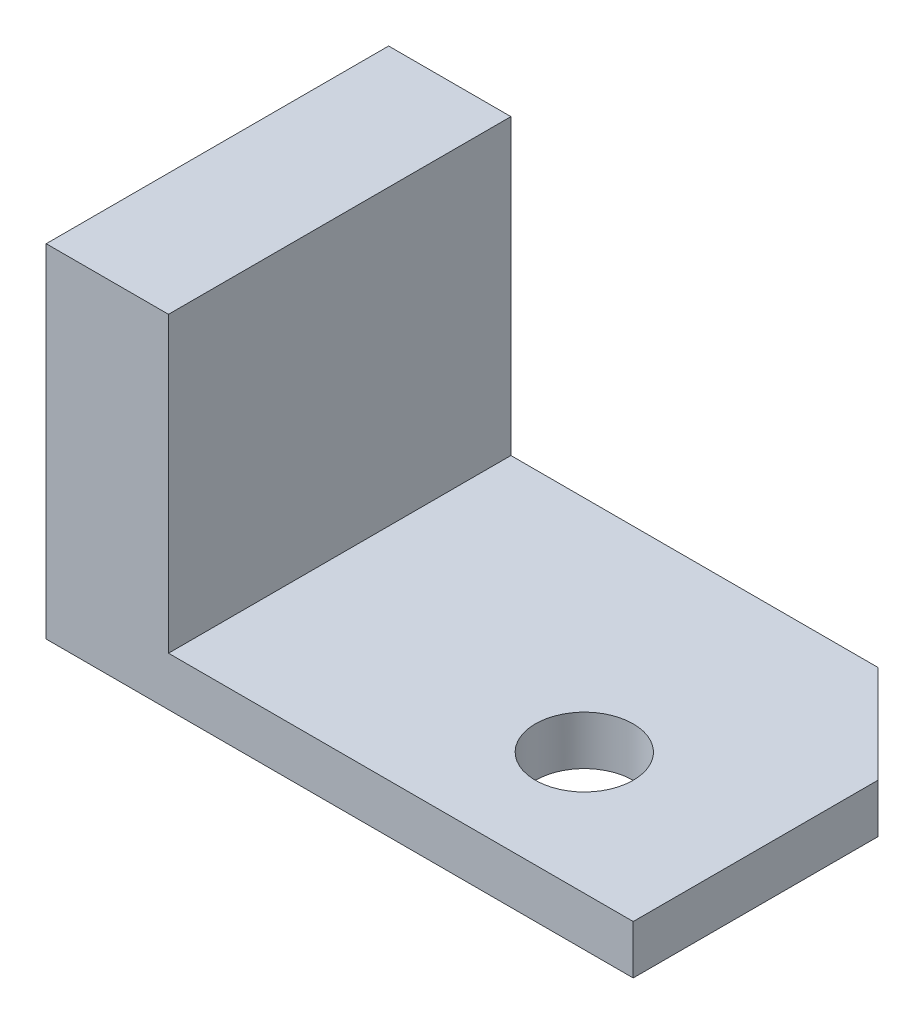
ISO-10303-21;
HEADER;
FILE_DESCRIPTION(('STEP AP214'),'2;1');
FILE_NAME('part.step','',(''),(''),'','','');
FILE_SCHEMA(('AUTOMOTIVE_DESIGN { 1 0 10303 214 1 1 1 1 }'));
ENDSEC;
DATA;
#1=APPLICATION_CONTEXT('core data for automotive mechanical design processes');
#2=APPLICATION_PROTOCOL_DEFINITION('international standard','automotive_design',2000,#1);
#3=PRODUCT_CONTEXT('',#1,'mechanical');
#4=PRODUCT('Part','Part','',(#3));
#5=PRODUCT_RELATED_PRODUCT_CATEGORY('part','',(#4));
#6=PRODUCT_DEFINITION_FORMATION('','',#4);
#7=PRODUCT_DEFINITION_CONTEXT('part definition',#1,'design');
#8=PRODUCT_DEFINITION('design','',#6,#7);
#9=PRODUCT_DEFINITION_SHAPE('','',#8);
#10=(LENGTH_UNIT() NAMED_UNIT(*) SI_UNIT(.MILLI.,.METRE.));
#11=(NAMED_UNIT(*) PLANE_ANGLE_UNIT() SI_UNIT($,.RADIAN.));
#12=(NAMED_UNIT(*) SI_UNIT($,.STERADIAN.) SOLID_ANGLE_UNIT());
#13=UNCERTAINTY_MEASURE_WITH_UNIT(LENGTH_MEASURE(1.E-05),#10,'distance_accuracy_value','');
#14=(GEOMETRIC_REPRESENTATION_CONTEXT(3) GLOBAL_UNCERTAINTY_ASSIGNED_CONTEXT((#13)) GLOBAL_UNIT_ASSIGNED_CONTEXT((#10,
#11,#12)) REPRESENTATION_CONTEXT('',''));
#15=CARTESIAN_POINT('',(0.,0.,0.));
#16=DIRECTION('',(0.,0.,1.));
#17=DIRECTION('',(1.,0.,0.));
#18=AXIS2_PLACEMENT_3D('',#15,#16,#17);
#19=CARTESIAN_POINT('',(0.,10.,0.));
#20=DIRECTION('',(0.,-1.,0.));
#21=DIRECTION('',(0.,0.,-1.));
#22=AXIS2_PLACEMENT_3D('',#19,#20,#21);
#23=PLANE('',#22);
#24=CARTESIAN_POINT('',(85.,10.,-25.));
#25=DIRECTION('',(0.,-1.,0.));
#26=DIRECTION('',(0.,0.,-1.));
#27=AXIS2_PLACEMENT_3D('',#24,#25,#26);
#28=CIRCLE('',#27,9.99999999999999);
#29=CARTESIAN_POINT('',(85.,10.,-35.));
#30=VERTEX_POINT('',#29);
#31=EDGE_CURVE('E134',#30,#30,#28,.F.);
#32=ORIENTED_EDGE('',*,*,#31,.F.);
#33=EDGE_LOOP('',(#32));
#34=FACE_BOUND('',#33,.T.);
#35=DIRECTION('',(0.,0.,-1.));
#36=VECTOR('',#35,1.);
#37=CARTESIAN_POINT('',(120.,10.,0.));
#38=LINE('',#37,#36);
#39=CARTESIAN_POINT('',(120.,10.,0.));
#40=VERTEX_POINT('',#39);
#41=CARTESIAN_POINT('',(120.,10.,-50.));
#42=VERTEX_POINT('',#41);
#43=EDGE_CURVE('E145',#40,#42,#38,.T.);
#44=ORIENTED_EDGE('',*,*,#43,.T.);
#45=DIRECTION('',(0.707106781186548,0.,0.707106781186547));
#46=VECTOR('',#45,1.);
#47=CARTESIAN_POINT('',(99.9999999999999,10.,-70.));
#48=LINE('',#47,#46);
#49=CARTESIAN_POINT('',(99.9999999999999,10.,-70.));
#50=VERTEX_POINT('',#49);
#51=EDGE_CURVE('E11',#42,#50,#48,.F.);
#52=ORIENTED_EDGE('',*,*,#51,.T.);
#53=DIRECTION('',(-1.,0.,0.));
#54=VECTOR('',#53,1.);
#55=CARTESIAN_POINT('',(0.,10.,-70.));
#56=LINE('',#55,#54);
#57=CARTESIAN_POINT('',(25.,10.,-70.));
#58=VERTEX_POINT('',#57);
#59=EDGE_CURVE('E150',#50,#58,#56,.T.);
#60=ORIENTED_EDGE('',*,*,#59,.T.);
#61=DIRECTION('',(0.,0.,-1.));
#62=VECTOR('',#61,1.);
#63=CARTESIAN_POINT('',(25.,10.,0.));
#64=LINE('',#63,#62);
#65=CARTESIAN_POINT('',(25.,10.,0.));
#66=VERTEX_POINT('',#65);
#67=EDGE_CURVE('E126',#66,#58,#64,.T.);
#68=ORIENTED_EDGE('',*,*,#67,.F.);
#69=DIRECTION('',(1.,0.,0.));
#70=VECTOR('',#69,1.);
#71=CARTESIAN_POINT('',(0.,10.,0.));
#72=LINE('',#71,#70);
#73=EDGE_CURVE('E142',#66,#40,#72,.T.);
#74=ORIENTED_EDGE('',*,*,#73,.T.);
#75=EDGE_LOOP('',(#44,#52,#60,#68,#74));
#76=FACE_BOUND('',#75,.T.);
#77=ADVANCED_FACE('F41',(#34,#76),#23,.F.);
#78=CARTESIAN_POINT('',(0.,10.,0.));
#79=DIRECTION('',(1.,0.,0.));
#80=DIRECTION('',(0.,0.,-1.));
#81=AXIS2_PLACEMENT_3D('',#78,#79,#80);
#82=PLANE('',#81);
#83=DIRECTION('',(0.,0.,1.));
#84=VECTOR('',#83,1.);
#85=CARTESIAN_POINT('',(0.,0.,0.));
#86=LINE('',#85,#84);
#87=CARTESIAN_POINT('',(0.,0.,-70.));
#88=VERTEX_POINT('',#87);
#89=CARTESIAN_POINT('',(0.,0.,0.));
#90=VERTEX_POINT('',#89);
#91=EDGE_CURVE('E108',#88,#90,#86,.T.);
#92=ORIENTED_EDGE('',*,*,#91,.T.);
#93=DIRECTION('',(0.,-1.,0.));
#94=VECTOR('',#93,1.);
#95=CARTESIAN_POINT('',(0.,10.,0.));
#96=LINE('',#95,#94);
#97=CARTESIAN_POINT('',(0.,70.,0.));
#98=VERTEX_POINT('',#97);
#99=EDGE_CURVE('E105',#98,#90,#96,.T.);
#100=ORIENTED_EDGE('',*,*,#99,.F.);
#101=DIRECTION('',(0.,0.,1.));
#102=VECTOR('',#101,1.);
#103=CARTESIAN_POINT('',(0.,70.,0.));
#104=LINE('',#103,#102);
#105=CARTESIAN_POINT('',(0.,70.,-70.));
#106=VERTEX_POINT('',#105);
#107=EDGE_CURVE('E110',#106,#98,#104,.T.);
#108=ORIENTED_EDGE('',*,*,#107,.F.);
#109=DIRECTION('',(0.,-1.,0.));
#110=VECTOR('',#109,1.);
#111=CARTESIAN_POINT('',(0.,10.,-70.));
#112=LINE('',#111,#110);
#113=EDGE_CURVE('E149',#106,#88,#112,.T.);
#114=ORIENTED_EDGE('',*,*,#113,.T.);
#115=EDGE_LOOP('',(#92,#100,#108,#114));
#116=FACE_BOUND('',#115,.T.);
#117=ADVANCED_FACE('F102',(#116),#82,.F.);
#118=CARTESIAN_POINT('',(0.,10.,0.));
#119=DIRECTION('',(0.,0.,-1.));
#120=DIRECTION('',(-1.,0.,0.));
#121=AXIS2_PLACEMENT_3D('',#118,#119,#120);
#122=PLANE('',#121);
#123=DIRECTION('',(1.,0.,0.));
#124=VECTOR('',#123,1.);
#125=CARTESIAN_POINT('',(0.,0.,0.));
#126=LINE('',#125,#124);
#127=CARTESIAN_POINT('',(120.,0.,0.));
#128=VERTEX_POINT('',#127);
#129=EDGE_CURVE('E151',#90,#128,#126,.T.);
#130=ORIENTED_EDGE('',*,*,#129,.T.);
#131=DIRECTION('',(0.,-1.,0.));
#132=VECTOR('',#131,1.);
#133=CARTESIAN_POINT('',(120.,10.,0.));
#134=LINE('',#133,#132);
#135=EDGE_CURVE('E115',#40,#128,#134,.T.);
#136=ORIENTED_EDGE('',*,*,#135,.F.);
#137=ORIENTED_EDGE('',*,*,#73,.F.);
#138=DIRECTION('',(0.,-1.,0.));
#139=VECTOR('',#138,1.);
#140=CARTESIAN_POINT('',(25.,70.,0.));
#141=LINE('',#140,#139);
#142=CARTESIAN_POINT('',(25.,70.,0.));
#143=VERTEX_POINT('',#142);
#144=EDGE_CURVE('E118',#143,#66,#141,.T.);
#145=ORIENTED_EDGE('',*,*,#144,.F.);
#146=DIRECTION('',(1.,0.,0.));
#147=VECTOR('',#146,1.);
#148=CARTESIAN_POINT('',(0.,70.,0.));
#149=LINE('',#148,#147);
#150=EDGE_CURVE('E113',#98,#143,#149,.T.);
#151=ORIENTED_EDGE('',*,*,#150,.F.);
#152=ORIENTED_EDGE('',*,*,#99,.T.);
#153=EDGE_LOOP('',(#130,#136,#137,#145,#151,#152));
#154=FACE_BOUND('',#153,.T.);
#155=ADVANCED_FACE('F119',(#154),#122,.F.);
#156=CARTESIAN_POINT('',(120.,10.,0.));
#157=DIRECTION('',(-1.,0.,0.));
#158=DIRECTION('',(0.,0.,1.));
#159=AXIS2_PLACEMENT_3D('',#156,#157,#158);
#160=PLANE('',#159);
#161=DIRECTION('',(0.,0.,-1.));
#162=VECTOR('',#161,1.);
#163=CARTESIAN_POINT('',(120.,0.,0.));
#164=LINE('',#163,#162);
#165=CARTESIAN_POINT('',(120.,0.,-50.));
#166=VERTEX_POINT('',#165);
#167=EDGE_CURVE('E153',#128,#166,#164,.T.);
#168=ORIENTED_EDGE('',*,*,#167,.T.);
#169=DIRECTION('',(0.,1.,0.));
#170=VECTOR('',#169,1.);
#171=CARTESIAN_POINT('',(120.,10.,-50.));
#172=LINE('',#171,#170);
#173=EDGE_CURVE('E49',#166,#42,#172,.T.);
#174=ORIENTED_EDGE('',*,*,#173,.T.);
#175=ORIENTED_EDGE('',*,*,#43,.F.);
#176=ORIENTED_EDGE('',*,*,#135,.T.);
#177=EDGE_LOOP('',(#168,#174,#175,#176));
#178=FACE_BOUND('',#177,.T.);
#179=ADVANCED_FACE('F166',(#178),#160,.F.);
#180=CARTESIAN_POINT('',(0.,10.,-70.));
#181=DIRECTION('',(0.,0.,1.));
#182=DIRECTION('',(1.,0.,0.));
#183=AXIS2_PLACEMENT_3D('',#180,#181,#182);
#184=PLANE('',#183);
#185=ORIENTED_EDGE('',*,*,#59,.F.);
#186=DIRECTION('',(0.,-1.,0.));
#187=VECTOR('',#186,1.);
#188=CARTESIAN_POINT('',(99.9999999999999,10.,-70.));
#189=LINE('',#188,#187);
#190=CARTESIAN_POINT('',(99.9999999999999,0.,-70.));
#191=VERTEX_POINT('',#190);
#192=EDGE_CURVE('E112',#50,#191,#189,.T.);
#193=ORIENTED_EDGE('',*,*,#192,.T.);
#194=DIRECTION('',(-1.,0.,0.));
#195=VECTOR('',#194,1.);
#196=CARTESIAN_POINT('',(0.,0.,-70.));
#197=LINE('',#196,#195);
#198=EDGE_CURVE('E144',#191,#88,#197,.T.);
#199=ORIENTED_EDGE('',*,*,#198,.T.);
#200=ORIENTED_EDGE('',*,*,#113,.F.);
#201=DIRECTION('',(-1.,0.,0.));
#202=VECTOR('',#201,1.);
#203=CARTESIAN_POINT('',(0.,70.,-70.));
#204=LINE('',#203,#202);
#205=CARTESIAN_POINT('',(25.,70.,-70.));
#206=VERTEX_POINT('',#205);
#207=EDGE_CURVE('E130',#206,#106,#204,.T.);
#208=ORIENTED_EDGE('',*,*,#207,.F.);
#209=DIRECTION('',(0.,-1.,0.));
#210=VECTOR('',#209,1.);
#211=CARTESIAN_POINT('',(25.,70.,-70.));
#212=LINE('',#211,#210);
#213=EDGE_CURVE('E139',#206,#58,#212,.T.);
#214=ORIENTED_EDGE('',*,*,#213,.T.);
#215=EDGE_LOOP('',(#185,#193,#199,#200,#208,#214));
#216=FACE_BOUND('',#215,.T.);
#217=ADVANCED_FACE('F163',(#216),#184,.F.);
#218=CARTESIAN_POINT('',(0.,0.,0.));
#219=DIRECTION('',(0.,-1.,0.));
#220=DIRECTION('',(0.,0.,-1.));
#221=AXIS2_PLACEMENT_3D('',#218,#219,#220);
#222=PLANE('',#221);
#223=CARTESIAN_POINT('',(85.,0.,-25.));
#224=DIRECTION('',(0.,1.,0.));
#225=DIRECTION('',(0.,0.,1.));
#226=AXIS2_PLACEMENT_3D('',#223,#224,#225);
#227=CIRCLE('',#226,9.99999999999999);
#228=CARTESIAN_POINT('',(85.,0.,-15.));
#229=VERTEX_POINT('',#228);
#230=EDGE_CURVE('E268',#229,#229,#227,.T.);
#231=ORIENTED_EDGE('',*,*,#230,.T.);
#232=EDGE_LOOP('',(#231));
#233=FACE_BOUND('',#232,.T.);
#234=ORIENTED_EDGE('',*,*,#198,.F.);
#235=DIRECTION('',(-0.707106781186548,0.,-0.707106781186547));
#236=VECTOR('',#235,1.);
#237=CARTESIAN_POINT('',(84.9999999999999,0.,-85.));
#238=LINE('',#237,#236);
#239=EDGE_CURVE('E63',#191,#166,#238,.F.);
#240=ORIENTED_EDGE('',*,*,#239,.T.);
#241=ORIENTED_EDGE('',*,*,#167,.F.);
#242=ORIENTED_EDGE('',*,*,#129,.F.);
#243=ORIENTED_EDGE('',*,*,#91,.F.);
#244=EDGE_LOOP('',(#234,#240,#241,#242,#243));
#245=FACE_BOUND('',#244,.T.);
#246=ADVANCED_FACE('F170',(#233,#245),#222,.T.);
#247=CARTESIAN_POINT('',(25.,70.,0.));
#248=DIRECTION('',(-1.,0.,0.));
#249=DIRECTION('',(0.,0.,1.));
#250=AXIS2_PLACEMENT_3D('',#247,#248,#249);
#251=PLANE('',#250);
#252=ORIENTED_EDGE('',*,*,#67,.T.);
#253=ORIENTED_EDGE('',*,*,#213,.F.);
#254=DIRECTION('',(0.,0.,-1.));
#255=VECTOR('',#254,1.);
#256=CARTESIAN_POINT('',(25.,70.,0.));
#257=LINE('',#256,#255);
#258=EDGE_CURVE('E124',#143,#206,#257,.T.);
#259=ORIENTED_EDGE('',*,*,#258,.F.);
#260=ORIENTED_EDGE('',*,*,#144,.T.);
#261=EDGE_LOOP('',(#252,#253,#259,#260));
#262=FACE_BOUND('',#261,.T.);
#263=ADVANCED_FACE('F188',(#262),#251,.F.);
#264=CARTESIAN_POINT('',(0.,70.,0.));
#265=DIRECTION('',(0.,-1.,0.));
#266=DIRECTION('',(0.,0.,-1.));
#267=AXIS2_PLACEMENT_3D('',#264,#265,#266);
#268=PLANE('',#267);
#269=ORIENTED_EDGE('',*,*,#107,.T.);
#270=ORIENTED_EDGE('',*,*,#150,.T.);
#271=ORIENTED_EDGE('',*,*,#258,.T.);
#272=ORIENTED_EDGE('',*,*,#207,.T.);
#273=EDGE_LOOP('',(#269,#270,#271,#272));
#274=FACE_BOUND('',#273,.T.);
#275=ADVANCED_FACE('F121',(#274),#268,.F.);
#276=CARTESIAN_POINT('',(85.,70.,-25.));
#277=DIRECTION('',(0.,-1.,0.));
#278=DIRECTION('',(0.,0.,-1.));
#279=AXIS2_PLACEMENT_3D('',#276,#277,#278);
#280=CYLINDRICAL_SURFACE('',#279,9.99999999999999);
#281=ORIENTED_EDGE('',*,*,#230,.F.);
#282=EDGE_LOOP('',(#281));
#283=FACE_BOUND('',#282,.T.);
#284=ORIENTED_EDGE('',*,*,#31,.T.);
#285=EDGE_LOOP('',(#284));
#286=FACE_BOUND('',#285,.T.);
#287=ADVANCED_FACE('F171',(#283,#286),#280,.F.);
#288=CARTESIAN_POINT('',(99.9999999999999,10.,-70.));
#289=DIRECTION('',(-0.707106781186547,0.,0.707106781186548));
#290=DIRECTION('',(0.,-1.,0.));
#291=AXIS2_PLACEMENT_3D('',#288,#289,#290);
#292=PLANE('',#291);
#293=ORIENTED_EDGE('',*,*,#51,.F.);
#294=ORIENTED_EDGE('',*,*,#173,.F.);
#295=ORIENTED_EDGE('',*,*,#239,.F.);
#296=ORIENTED_EDGE('',*,*,#192,.F.);
#297=EDGE_LOOP('',(#293,#294,#295,#296));
#298=FACE_BOUND('',#297,.T.);
#299=ADVANCED_FACE('F42',(#298),#292,.F.);
#300=CLOSED_SHELL('',(#77,#117,#155,#179,#217,#246,#263,#275,#287,#299));
#301=MANIFOLD_SOLID_BREP('B2',#300);
#302=ADVANCED_BREP_SHAPE_REPRESENTATION('',(#18,#301),#14);
#303=SHAPE_DEFINITION_REPRESENTATION(#9,#302);
ENDSEC;
END-ISO-10303-21;
